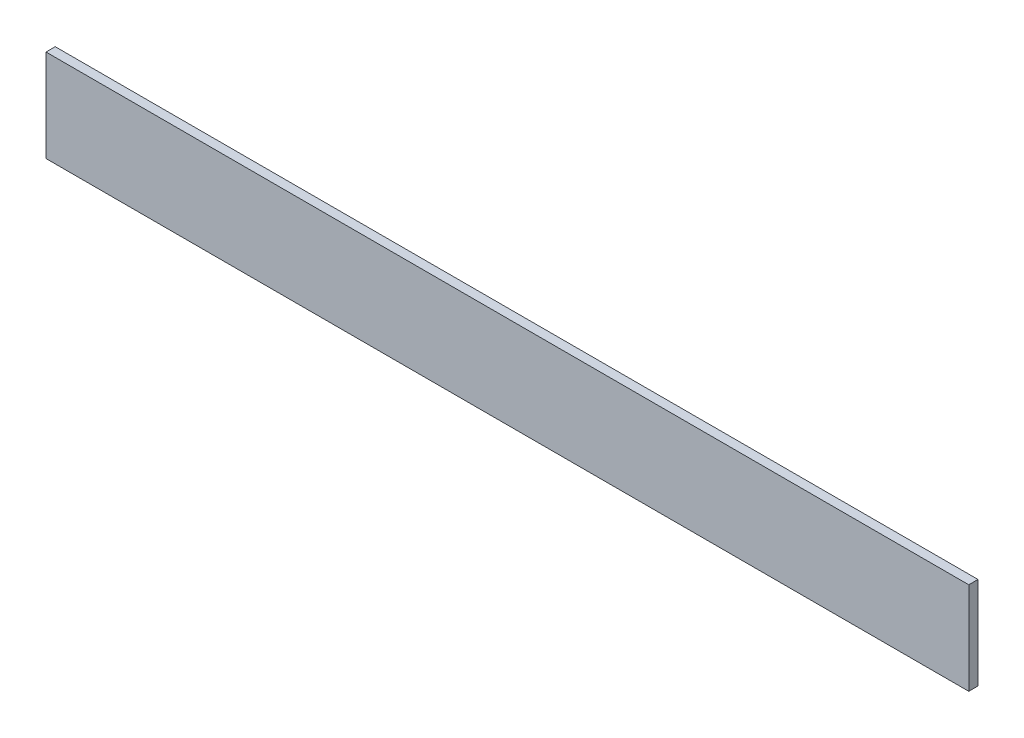
ISO-10303-21;
HEADER;
FILE_DESCRIPTION(('STEP AP214'),'2;1');
FILE_NAME('part.step','',(''),(''),'','','');
FILE_SCHEMA(('AUTOMOTIVE_DESIGN { 1 0 10303 214 1 1 1 1 }'));
ENDSEC;
DATA;
#1=APPLICATION_CONTEXT('core data for automotive mechanical design processes');
#2=APPLICATION_PROTOCOL_DEFINITION('international standard','automotive_design',2000,#1);
#3=PRODUCT_CONTEXT('',#1,'mechanical');
#4=PRODUCT('Part','Part','',(#3));
#5=PRODUCT_RELATED_PRODUCT_CATEGORY('part','',(#4));
#6=PRODUCT_DEFINITION_FORMATION('','',#4);
#7=PRODUCT_DEFINITION_CONTEXT('part definition',#1,'design');
#8=PRODUCT_DEFINITION('design','',#6,#7);
#9=PRODUCT_DEFINITION_SHAPE('','',#8);
#10=(LENGTH_UNIT() NAMED_UNIT(*) SI_UNIT(.MILLI.,.METRE.));
#11=(NAMED_UNIT(*) PLANE_ANGLE_UNIT() SI_UNIT($,.RADIAN.));
#12=(NAMED_UNIT(*) SI_UNIT($,.STERADIAN.) SOLID_ANGLE_UNIT());
#13=UNCERTAINTY_MEASURE_WITH_UNIT(LENGTH_MEASURE(1.E-05),#10,'distance_accuracy_value','');
#14=(GEOMETRIC_REPRESENTATION_CONTEXT(3) GLOBAL_UNCERTAINTY_ASSIGNED_CONTEXT((#13)) GLOBAL_UNIT_ASSIGNED_CONTEXT((#10,
#11,#12)) REPRESENTATION_CONTEXT('',''));
#15=CARTESIAN_POINT('',(0.,0.,0.));
#16=DIRECTION('',(0.,0.,1.));
#17=DIRECTION('',(1.,0.,0.));
#18=AXIS2_PLACEMENT_3D('',#15,#16,#17);
#19=CARTESIAN_POINT('',(-198.183760683761,55.8226495726496,5.));
#20=DIRECTION('',(1.,0.,0.));
#21=DIRECTION('',(0.,1.,0.));
#22=AXIS2_PLACEMENT_3D('',#19,#20,#21);
#23=PLANE('',#22);
#24=DIRECTION('',(0.,-1.,0.));
#25=VECTOR('',#24,1.);
#26=CARTESIAN_POINT('',(-198.183760683761,55.8226495726496,0.));
#27=LINE('',#26,#25);
#28=CARTESIAN_POINT('',(-198.183760683761,55.8226495726496,0.));
#29=VERTEX_POINT('',#28);
#30=CARTESIAN_POINT('',(-198.183760683761,5.82264957264955,0.));
#31=VERTEX_POINT('',#30);
#32=EDGE_CURVE('E100',#29,#31,#27,.T.);
#33=ORIENTED_EDGE('',*,*,#32,.T.);
#34=DIRECTION('',(0.,0.,-1.));
#35=VECTOR('',#34,1.);
#36=CARTESIAN_POINT('',(-198.183760683761,5.82264957264955,5.));
#37=LINE('',#36,#35);
#38=CARTESIAN_POINT('',(-198.183760683761,5.82264957264955,5.));
#39=VERTEX_POINT('',#38);
#40=EDGE_CURVE('E11',#39,#31,#37,.T.);
#41=ORIENTED_EDGE('',*,*,#40,.F.);
#42=DIRECTION('',(0.,-1.,0.));
#43=VECTOR('',#42,1.);
#44=CARTESIAN_POINT('',(-198.183760683761,55.8226495726496,5.));
#45=LINE('',#44,#43);
#46=CARTESIAN_POINT('',(-198.183760683761,55.8226495726496,5.));
#47=VERTEX_POINT('',#46);
#48=EDGE_CURVE('E88',#47,#39,#45,.T.);
#49=ORIENTED_EDGE('',*,*,#48,.F.);
#50=DIRECTION('',(0.,0.,-1.));
#51=VECTOR('',#50,1.);
#52=CARTESIAN_POINT('',(-198.183760683761,55.8226495726496,5.));
#53=LINE('',#52,#51);
#54=EDGE_CURVE('E96',#47,#29,#53,.T.);
#55=ORIENTED_EDGE('',*,*,#54,.T.);
#56=EDGE_LOOP('',(#33,#41,#49,#55));
#57=FACE_BOUND('',#56,.T.);
#58=ADVANCED_FACE('F37',(#57),#23,.F.);
#59=CARTESIAN_POINT('',(-198.183760683761,5.82264957264955,5.));
#60=DIRECTION('',(0.,1.,0.));
#61=DIRECTION('',(0.,0.,1.));
#62=AXIS2_PLACEMENT_3D('',#59,#60,#61);
#63=PLANE('',#62);
#64=DIRECTION('',(1.,0.,0.));
#65=VECTOR('',#64,1.);
#66=CARTESIAN_POINT('',(-198.183760683761,5.82264957264955,0.));
#67=LINE('',#66,#65);
#68=CARTESIAN_POINT('',(301.816239316239,5.82264957264955,0.));
#69=VERTEX_POINT('',#68);
#70=EDGE_CURVE('E92',#31,#69,#67,.T.);
#71=ORIENTED_EDGE('',*,*,#70,.T.);
#72=DIRECTION('',(0.,0.,-1.));
#73=VECTOR('',#72,1.);
#74=CARTESIAN_POINT('',(301.816239316239,5.82264957264955,5.));
#75=LINE('',#74,#73);
#76=CARTESIAN_POINT('',(301.816239316239,5.82264957264955,5.));
#77=VERTEX_POINT('',#76);
#78=EDGE_CURVE('E45',#77,#69,#75,.T.);
#79=ORIENTED_EDGE('',*,*,#78,.F.);
#80=DIRECTION('',(1.,0.,0.));
#81=VECTOR('',#80,1.);
#82=CARTESIAN_POINT('',(-198.183760683761,5.82264957264955,5.));
#83=LINE('',#82,#81);
#84=EDGE_CURVE('E83',#39,#77,#83,.T.);
#85=ORIENTED_EDGE('',*,*,#84,.F.);
#86=ORIENTED_EDGE('',*,*,#40,.T.);
#87=EDGE_LOOP('',(#71,#79,#85,#86));
#88=FACE_BOUND('',#87,.T.);
#89=ADVANCED_FACE('F91',(#88),#63,.F.);
#90=CARTESIAN_POINT('',(301.816239316239,55.8226495726496,5.));
#91=DIRECTION('',(-1.,0.,0.));
#92=DIRECTION('',(0.,0.,1.));
#93=AXIS2_PLACEMENT_3D('',#90,#91,#92);
#94=PLANE('',#93);
#95=DIRECTION('',(0.,1.,0.));
#96=VECTOR('',#95,1.);
#97=CARTESIAN_POINT('',(301.816239316239,55.8226495726496,0.));
#98=LINE('',#97,#96);
#99=CARTESIAN_POINT('',(301.816239316239,55.8226495726496,0.));
#100=VERTEX_POINT('',#99);
#101=EDGE_CURVE('E70',#69,#100,#98,.T.);
#102=ORIENTED_EDGE('',*,*,#101,.T.);
#103=DIRECTION('',(0.,0.,-1.));
#104=VECTOR('',#103,1.);
#105=CARTESIAN_POINT('',(301.816239316239,55.8226495726496,5.));
#106=LINE('',#105,#104);
#107=CARTESIAN_POINT('',(301.816239316239,55.8226495726496,5.));
#108=VERTEX_POINT('',#107);
#109=EDGE_CURVE('E93',#108,#100,#106,.T.);
#110=ORIENTED_EDGE('',*,*,#109,.F.);
#111=DIRECTION('',(0.,1.,0.));
#112=VECTOR('',#111,1.);
#113=CARTESIAN_POINT('',(301.816239316239,55.8226495726496,5.));
#114=LINE('',#113,#112);
#115=EDGE_CURVE('E86',#77,#108,#114,.T.);
#116=ORIENTED_EDGE('',*,*,#115,.F.);
#117=ORIENTED_EDGE('',*,*,#78,.T.);
#118=EDGE_LOOP('',(#102,#110,#116,#117));
#119=FACE_BOUND('',#118,.T.);
#120=ADVANCED_FACE('F94',(#119),#94,.F.);
#121=CARTESIAN_POINT('',(-198.183760683761,55.8226495726496,5.));
#122=DIRECTION('',(0.,-1.,0.));
#123=DIRECTION('',(0.,0.,-1.));
#124=AXIS2_PLACEMENT_3D('',#121,#122,#123);
#125=PLANE('',#124);
#126=DIRECTION('',(-1.,0.,0.));
#127=VECTOR('',#126,1.);
#128=CARTESIAN_POINT('',(-198.183760683761,55.8226495726496,0.));
#129=LINE('',#128,#127);
#130=EDGE_CURVE('E76',#100,#29,#129,.T.);
#131=ORIENTED_EDGE('',*,*,#130,.T.);
#132=ORIENTED_EDGE('',*,*,#54,.F.);
#133=DIRECTION('',(-1.,0.,0.));
#134=VECTOR('',#133,1.);
#135=CARTESIAN_POINT('',(-198.183760683761,55.8226495726496,5.));
#136=LINE('',#135,#134);
#137=EDGE_CURVE('E53',#108,#47,#136,.T.);
#138=ORIENTED_EDGE('',*,*,#137,.F.);
#139=ORIENTED_EDGE('',*,*,#109,.T.);
#140=EDGE_LOOP('',(#131,#132,#138,#139));
#141=FACE_BOUND('',#140,.T.);
#142=ADVANCED_FACE('F107',(#141),#125,.F.);
#143=CARTESIAN_POINT('',(0.,0.,5.));
#144=DIRECTION('',(0.,0.,1.));
#145=DIRECTION('',(1.,0.,0.));
#146=AXIS2_PLACEMENT_3D('',#143,#144,#145);
#147=PLANE('',#146);
#148=ORIENTED_EDGE('',*,*,#48,.T.);
#149=ORIENTED_EDGE('',*,*,#84,.T.);
#150=ORIENTED_EDGE('',*,*,#115,.T.);
#151=ORIENTED_EDGE('',*,*,#137,.T.);
#152=EDGE_LOOP('',(#148,#149,#150,#151));
#153=FACE_BOUND('',#152,.T.);
#154=ADVANCED_FACE('F84',(#153),#147,.T.);
#155=CARTESIAN_POINT('',(0.,0.,0.));
#156=DIRECTION('',(0.,0.,1.));
#157=DIRECTION('',(1.,0.,0.));
#158=AXIS2_PLACEMENT_3D('',#155,#156,#157);
#159=PLANE('',#158);
#160=ORIENTED_EDGE('',*,*,#32,.F.);
#161=ORIENTED_EDGE('',*,*,#130,.F.);
#162=ORIENTED_EDGE('',*,*,#101,.F.);
#163=ORIENTED_EDGE('',*,*,#70,.F.);
#164=EDGE_LOOP('',(#160,#161,#162,#163));
#165=FACE_BOUND('',#164,.T.);
#166=ADVANCED_FACE('F110',(#165),#159,.F.);
#167=CLOSED_SHELL('',(#58,#89,#120,#142,#154,#166));
#168=MANIFOLD_SOLID_BREP('B2',#167);
#169=ADVANCED_BREP_SHAPE_REPRESENTATION('',(#18,#168),#14);
#170=SHAPE_DEFINITION_REPRESENTATION(#9,#169);
ENDSEC;
END-ISO-10303-21;
